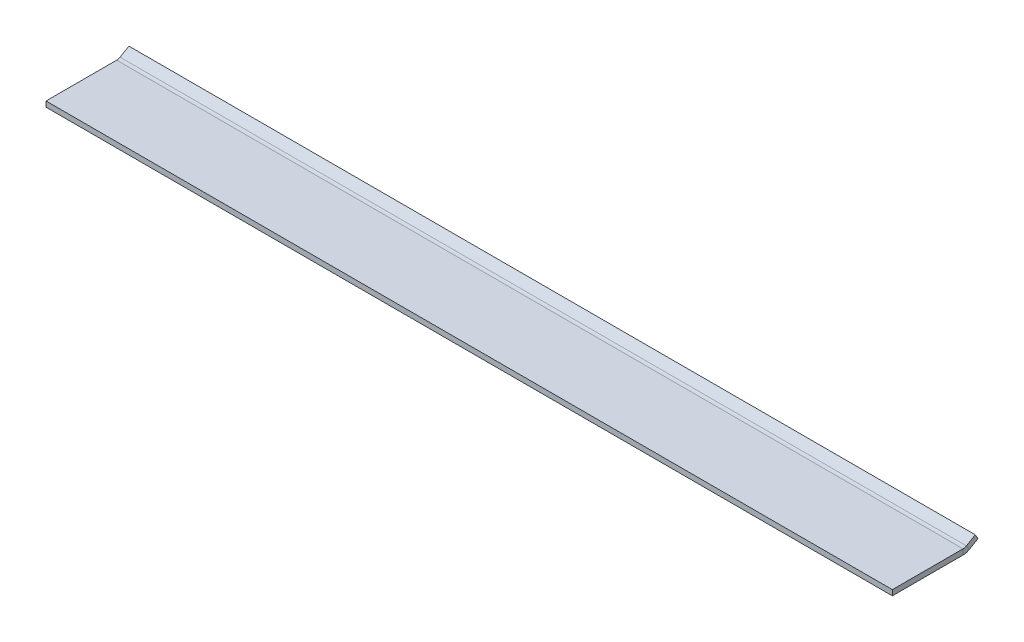
ISO-10303-21;
HEADER;
FILE_DESCRIPTION(('STEP AP214'),'2;1');
FILE_NAME('part.step','',(''),(''),'','','');
FILE_SCHEMA(('AUTOMOTIVE_DESIGN { 1 0 10303 214 1 1 1 1 }'));
ENDSEC;
DATA;
#1=APPLICATION_CONTEXT('core data for automotive mechanical design processes');
#2=APPLICATION_PROTOCOL_DEFINITION('international standard','automotive_design',2000,#1);
#3=PRODUCT_CONTEXT('',#1,'mechanical');
#4=PRODUCT('Part','Part','',(#3));
#5=PRODUCT_RELATED_PRODUCT_CATEGORY('part','',(#4));
#6=PRODUCT_DEFINITION_FORMATION('','',#4);
#7=PRODUCT_DEFINITION_CONTEXT('part definition',#1,'design');
#8=PRODUCT_DEFINITION('design','',#6,#7);
#9=PRODUCT_DEFINITION_SHAPE('','',#8);
#10=(LENGTH_UNIT() NAMED_UNIT(*) SI_UNIT(.MILLI.,.METRE.));
#11=(NAMED_UNIT(*) PLANE_ANGLE_UNIT() SI_UNIT($,.RADIAN.));
#12=(NAMED_UNIT(*) SI_UNIT($,.STERADIAN.) SOLID_ANGLE_UNIT());
#13=UNCERTAINTY_MEASURE_WITH_UNIT(LENGTH_MEASURE(1.E-05),#10,'distance_accuracy_value','');
#14=(GEOMETRIC_REPRESENTATION_CONTEXT(3) GLOBAL_UNCERTAINTY_ASSIGNED_CONTEXT((#13)) GLOBAL_UNIT_ASSIGNED_CONTEXT((#10,
#11,#12)) REPRESENTATION_CONTEXT('',''));
#15=CARTESIAN_POINT('',(0.,0.,0.));
#16=DIRECTION('',(0.,0.,1.));
#17=DIRECTION('',(1.,0.,0.));
#18=AXIS2_PLACEMENT_3D('',#15,#16,#17);
#19=CARTESIAN_POINT('',(-940.,-12.,92.5));
#20=DIRECTION('',(-1.,0.,0.));
#21=DIRECTION('',(0.,0.,1.));
#22=AXIS2_PLACEMENT_3D('',#19,#20,#21);
#23=PLANE('',#22);
#24=DIRECTION('',(0.,0.,1.));
#25=VECTOR('',#24,1.);
#26=CARTESIAN_POINT('',(-940.,0.,92.5));
#27=LINE('',#26,#25);
#28=CARTESIAN_POINT('',(-940.,1.04083408558608E-13,-64.480762113533));
#29=VERTEX_POINT('',#28);
#30=CARTESIAN_POINT('',(-940.,0.,92.5));
#31=VERTEX_POINT('',#30);
#32=EDGE_CURVE('E107',#29,#31,#27,.T.);
#33=ORIENTED_EDGE('',*,*,#32,.F.);
#34=DIRECTION('',(0.,-1.,0.));
#35=VECTOR('',#34,1.);
#36=CARTESIAN_POINT('',(-940.,1.04083408558608E-13,-64.480762113533));
#37=LINE('',#36,#35);
#38=CARTESIAN_POINT('',(-940.,-11.9999999999999,-64.480762113533));
#39=VERTEX_POINT('',#38);
#40=EDGE_CURVE('E120',#29,#39,#37,.T.);
#41=ORIENTED_EDGE('',*,*,#40,.T.);
#42=DIRECTION('',(0.,0.,1.));
#43=VECTOR('',#42,1.);
#44=CARTESIAN_POINT('',(-940.,-12.,92.5));
#45=LINE('',#44,#43);
#46=CARTESIAN_POINT('',(-940.,-12.,92.5));
#47=VERTEX_POINT('',#46);
#48=EDGE_CURVE('E114',#39,#47,#45,.T.);
#49=ORIENTED_EDGE('',*,*,#48,.T.);
#50=DIRECTION('',(0.,1.,0.));
#51=VECTOR('',#50,1.);
#52=CARTESIAN_POINT('',(-940.,-12.,92.5));
#53=LINE('',#52,#51);
#54=EDGE_CURVE('E63',#47,#31,#53,.T.);
#55=ORIENTED_EDGE('',*,*,#54,.T.);
#56=EDGE_LOOP('',(#33,#41,#49,#55));
#57=FACE_BOUND('',#56,.T.);
#58=ADVANCED_FACE('F59',(#57),#23,.T.);
#59=CARTESIAN_POINT('',(0.,-12.,0.));
#60=DIRECTION('',(0.,-1.,0.));
#61=DIRECTION('',(0.,0.,-1.));
#62=AXIS2_PLACEMENT_3D('',#59,#60,#61);
#63=PLANE('',#62);
#64=ORIENTED_EDGE('',*,*,#48,.F.);
#65=DIRECTION('',(-1.,0.,0.));
#66=VECTOR('',#65,1.);
#67=CARTESIAN_POINT('',(-940.,-11.9999999999999,-64.480762113533));
#68=LINE('',#67,#66);
#69=CARTESIAN_POINT('',(940.,-12.,-64.480762113533));
#70=VERTEX_POINT('',#69);
#71=EDGE_CURVE('E137',#39,#70,#68,.F.);
#72=ORIENTED_EDGE('',*,*,#71,.T.);
#73=DIRECTION('',(0.,0.,-1.));
#74=VECTOR('',#73,1.);
#75=CARTESIAN_POINT('',(940.,-12.,92.5));
#76=LINE('',#75,#74);
#77=CARTESIAN_POINT('',(940.,-12.,92.5));
#78=VERTEX_POINT('',#77);
#79=EDGE_CURVE('E112',#78,#70,#76,.T.);
#80=ORIENTED_EDGE('',*,*,#79,.F.);
#81=DIRECTION('',(1.,0.,0.));
#82=VECTOR('',#81,1.);
#83=CARTESIAN_POINT('',(-940.,-12.,92.5));
#84=LINE('',#83,#82);
#85=EDGE_CURVE('E99',#47,#78,#84,.T.);
#86=ORIENTED_EDGE('',*,*,#85,.F.);
#87=EDGE_LOOP('',(#64,#72,#80,#86));
#88=FACE_BOUND('',#87,.T.);
#89=ADVANCED_FACE('F227',(#88),#63,.T.);
#90=CARTESIAN_POINT('',(0.,0.,0.));
#91=DIRECTION('',(0.,-1.,0.));
#92=DIRECTION('',(0.,0.,-1.));
#93=AXIS2_PLACEMENT_3D('',#90,#91,#92);
#94=PLANE('',#93);
#95=DIRECTION('',(-1.,0.,0.));
#96=VECTOR('',#95,1.);
#97=CARTESIAN_POINT('',(-940.,1.04083408558608E-13,-64.480762113533));
#98=LINE('',#97,#96);
#99=CARTESIAN_POINT('',(940.,0.,-64.480762113533));
#100=VERTEX_POINT('',#99);
#101=EDGE_CURVE('E127',#29,#100,#98,.F.);
#102=ORIENTED_EDGE('',*,*,#101,.F.);
#103=ORIENTED_EDGE('',*,*,#32,.T.);
#104=DIRECTION('',(1.,0.,0.));
#105=VECTOR('',#104,1.);
#106=CARTESIAN_POINT('',(-940.,0.,92.5));
#107=LINE('',#106,#105);
#108=CARTESIAN_POINT('',(940.,0.,92.5));
#109=VERTEX_POINT('',#108);
#110=EDGE_CURVE('E97',#31,#109,#107,.T.);
#111=ORIENTED_EDGE('',*,*,#110,.T.);
#112=DIRECTION('',(0.,0.,-1.));
#113=VECTOR('',#112,1.);
#114=CARTESIAN_POINT('',(940.,0.,92.5));
#115=LINE('',#114,#113);
#116=EDGE_CURVE('E102',#109,#100,#115,.T.);
#117=ORIENTED_EDGE('',*,*,#116,.T.);
#118=EDGE_LOOP('',(#102,#103,#111,#117));
#119=FACE_BOUND('',#118,.T.);
#120=ADVANCED_FACE('F109',(#119),#94,.F.);
#121=CARTESIAN_POINT('',(940.,-12.,92.5));
#122=DIRECTION('',(1.,0.,0.));
#123=DIRECTION('',(0.,0.,-1.));
#124=AXIS2_PLACEMENT_3D('',#121,#122,#123);
#125=PLANE('',#124);
#126=DIRECTION('',(0.,-1.,0.));
#127=VECTOR('',#126,1.);
#128=CARTESIAN_POINT('',(940.,0.,-64.480762113533));
#129=LINE('',#128,#127);
#130=EDGE_CURVE('E104',#100,#70,#129,.T.);
#131=ORIENTED_EDGE('',*,*,#130,.F.);
#132=ORIENTED_EDGE('',*,*,#116,.F.);
#133=DIRECTION('',(0.,1.,0.));
#134=VECTOR('',#133,1.);
#135=CARTESIAN_POINT('',(940.,-12.,92.5));
#136=LINE('',#135,#134);
#137=EDGE_CURVE('E13',#78,#109,#136,.T.);
#138=ORIENTED_EDGE('',*,*,#137,.F.);
#139=ORIENTED_EDGE('',*,*,#79,.T.);
#140=EDGE_LOOP('',(#131,#132,#138,#139));
#141=FACE_BOUND('',#140,.T.);
#142=ADVANCED_FACE('F61',(#141),#125,.T.);
#143=CARTESIAN_POINT('',(-940.,-12.,92.5));
#144=DIRECTION('',(0.,0.,1.));
#145=DIRECTION('',(1.,0.,0.));
#146=AXIS2_PLACEMENT_3D('',#143,#144,#145);
#147=PLANE('',#146);
#148=ORIENTED_EDGE('',*,*,#110,.F.);
#149=ORIENTED_EDGE('',*,*,#54,.F.);
#150=ORIENTED_EDGE('',*,*,#85,.T.);
#151=ORIENTED_EDGE('',*,*,#137,.T.);
#152=EDGE_LOOP('',(#148,#149,#150,#151));
#153=FACE_BOUND('',#152,.T.);
#154=ADVANCED_FACE('F94',(#153),#147,.T.);
#155=CARTESIAN_POINT('',(940.,14.9999999999999,-64.480762113533));
#156=DIRECTION('',(1.,0.,0.));
#157=DIRECTION('',(0.,1.,0.));
#158=AXIS2_PLACEMENT_3D('',#155,#156,#157);
#159=PLANE('',#158);
#160=DIRECTION('',(0.,0.866025403784441,0.499999999999995));
#161=VECTOR('',#160,1.);
#162=CARTESIAN_POINT('',(940.,-8.38268590217991,-77.9807621135329));
#163=LINE('',#162,#161);
#164=CARTESIAN_POINT('',(940.,2.00961894323337,-71.9807621135329));
#165=VERTEX_POINT('',#164);
#166=CARTESIAN_POINT('',(940.,-8.38268590217993,-77.9807621135328));
#167=VERTEX_POINT('',#166);
#168=EDGE_CURVE('E141',#165,#167,#163,.F.);
#169=ORIENTED_EDGE('',*,*,#168,.F.);
#170=CARTESIAN_POINT('',(940.,14.9999999999999,-64.480762113533));
#171=DIRECTION('',(-1.,0.,0.));
#172=DIRECTION('',(0.,-1.,0.));
#173=AXIS2_PLACEMENT_3D('',#170,#171,#172);
#174=CIRCLE('',#173,14.9999999999999);
#175=EDGE_CURVE('E131',#100,#165,#174,.F.);
#176=ORIENTED_EDGE('',*,*,#175,.F.);
#177=ORIENTED_EDGE('',*,*,#130,.T.);
#178=CARTESIAN_POINT('',(940.,14.9999999999999,-64.480762113533));
#179=DIRECTION('',(-1.,0.,0.));
#180=DIRECTION('',(0.,-1.,0.));
#181=AXIS2_PLACEMENT_3D('',#178,#179,#180);
#182=CIRCLE('',#181,26.9999999999999);
#183=EDGE_CURVE('E74',#70,#167,#182,.F.);
#184=ORIENTED_EDGE('',*,*,#183,.T.);
#185=EDGE_LOOP('',(#169,#176,#177,#184));
#186=FACE_BOUND('',#185,.T.);
#187=ADVANCED_FACE('F229',(#186),#159,.T.);
#188=CARTESIAN_POINT('',(-940.,15.0000000000001,-64.480762113533));
#189=DIRECTION('',(1.,0.,0.));
#190=DIRECTION('',(0.,1.,0.));
#191=AXIS2_PLACEMENT_3D('',#188,#189,#190);
#192=PLANE('',#191);
#193=CARTESIAN_POINT('',(-940.,15.0000000000001,-64.480762113533));
#194=DIRECTION('',(-1.,0.,0.));
#195=DIRECTION('',(0.,-1.,0.));
#196=AXIS2_PLACEMENT_3D('',#193,#194,#195);
#197=CIRCLE('',#196,14.9999999999999);
#198=CARTESIAN_POINT('',(-940.,2.00961894323347,-71.9807621135329));
#199=VERTEX_POINT('',#198);
#200=EDGE_CURVE('E124',#199,#29,#197,.T.);
#201=ORIENTED_EDGE('',*,*,#200,.F.);
#202=DIRECTION('',(0.,0.866025403784441,0.499999999999995));
#203=VECTOR('',#202,1.);
#204=CARTESIAN_POINT('',(-940.,2.00961894323338,-71.9807621135329));
#205=LINE('',#204,#203);
#206=CARTESIAN_POINT('',(-940.,-8.38268590217992,-77.9807621135329));
#207=VERTEX_POINT('',#206);
#208=EDGE_CURVE('E147',#199,#207,#205,.F.);
#209=ORIENTED_EDGE('',*,*,#208,.T.);
#210=CARTESIAN_POINT('',(-940.,15.0000000000001,-64.480762113533));
#211=DIRECTION('',(-1.,0.,0.));
#212=DIRECTION('',(0.,-1.,0.));
#213=AXIS2_PLACEMENT_3D('',#210,#211,#212);
#214=CIRCLE('',#213,26.9999999999999);
#215=EDGE_CURVE('E134',#207,#39,#214,.T.);
#216=ORIENTED_EDGE('',*,*,#215,.T.);
#217=ORIENTED_EDGE('',*,*,#40,.F.);
#218=EDGE_LOOP('',(#201,#209,#216,#217));
#219=FACE_BOUND('',#218,.T.);
#220=ADVANCED_FACE('F221',(#219),#192,.F.);
#221=CARTESIAN_POINT('',(-940.,15.0000000000001,-64.480762113533));
#222=DIRECTION('',(-1.,0.,0.));
#223=DIRECTION('',(0.,-0.866025403784442,-0.499999999999995));
#224=AXIS2_PLACEMENT_3D('',#221,#222,#223);
#225=CYLINDRICAL_SURFACE('',#224,26.9999999999999);
#226=ORIENTED_EDGE('',*,*,#71,.F.);
#227=ORIENTED_EDGE('',*,*,#215,.F.);
#228=DIRECTION('',(-1.,0.,0.));
#229=VECTOR('',#228,1.);
#230=CARTESIAN_POINT('',(940.,-8.38268590217992,-77.9807621135329));
#231=LINE('',#230,#229);
#232=EDGE_CURVE('E150',#207,#167,#231,.F.);
#233=ORIENTED_EDGE('',*,*,#232,.T.);
#234=ORIENTED_EDGE('',*,*,#183,.F.);
#235=EDGE_LOOP('',(#226,#227,#233,#234));
#236=FACE_BOUND('',#235,.T.);
#237=ADVANCED_FACE('F228',(#236),#225,.T.);
#238=CARTESIAN_POINT('',(-940.,15.0000000000001,-64.480762113533));
#239=DIRECTION('',(-1.,0.,0.));
#240=DIRECTION('',(0.,-0.866025403784442,-0.499999999999995));
#241=AXIS2_PLACEMENT_3D('',#238,#239,#240);
#242=CYLINDRICAL_SURFACE('',#241,14.9999999999999);
#243=ORIENTED_EDGE('',*,*,#101,.T.);
#244=ORIENTED_EDGE('',*,*,#175,.T.);
#245=DIRECTION('',(-1.,0.,0.));
#246=VECTOR('',#245,1.);
#247=CARTESIAN_POINT('',(940.,2.00961894323338,-71.9807621135329));
#248=LINE('',#247,#246);
#249=EDGE_CURVE('E144',#165,#199,#248,.T.);
#250=ORIENTED_EDGE('',*,*,#249,.T.);
#251=ORIENTED_EDGE('',*,*,#200,.T.);
#252=EDGE_LOOP('',(#243,#244,#250,#251));
#253=FACE_BOUND('',#252,.T.);
#254=ADVANCED_FACE('F223',(#253),#242,.F.);
#255=CARTESIAN_POINT('',(940.,-10.3923048454133,-74.4999999999997));
#256=DIRECTION('',(-1.,0.,0.));
#257=DIRECTION('',(0.,0.,1.));
#258=AXIS2_PLACEMENT_3D('',#255,#256,#257);
#259=PLANE('',#258);
#260=ORIENTED_EDGE('',*,*,#168,.T.);
#261=DIRECTION('',(0.,-0.499999999999995,0.866025403784442));
#262=VECTOR('',#261,1.);
#263=CARTESIAN_POINT('',(940.,-50.4459797704433,-5.12499999999925));
#264=LINE('',#263,#262);
#265=CARTESIAN_POINT('',(940.,2.99999999999986,-97.6961524227065));
#266=VERTEX_POINT('',#265);
#267=EDGE_CURVE('E161',#266,#167,#264,.T.);
#268=ORIENTED_EDGE('',*,*,#267,.F.);
#269=DIRECTION('',(0.,0.866025403784442,0.499999999999995));
#270=VECTOR('',#269,1.);
#271=CARTESIAN_POINT('',(940.,2.99999999999985,-97.6961524227065));
#272=LINE('',#271,#270);
#273=CARTESIAN_POINT('',(940.,13.3923048454131,-91.6961524227065));
#274=VERTEX_POINT('',#273);
#275=EDGE_CURVE('E170',#266,#274,#272,.T.);
#276=ORIENTED_EDGE('',*,*,#275,.T.);
#277=DIRECTION('',(0.,0.499999999999995,-0.866025403784442));
#278=VECTOR('',#277,1.);
#279=CARTESIAN_POINT('',(940.,0.,-68.4999999999998));
#280=LINE('',#279,#278);
#281=EDGE_CURVE('E152',#274,#165,#280,.F.);
#282=ORIENTED_EDGE('',*,*,#281,.T.);
#283=EDGE_LOOP('',(#260,#268,#276,#282));
#284=FACE_BOUND('',#283,.T.);
#285=ADVANCED_FACE('F196',(#284),#259,.F.);
#286=CARTESIAN_POINT('',(-940.,2.99999999999986,-97.6961524227065));
#287=DIRECTION('',(1.,0.,0.));
#288=DIRECTION('',(0.,0.,-1.));
#289=AXIS2_PLACEMENT_3D('',#286,#287,#288);
#290=PLANE('',#289);
#291=ORIENTED_EDGE('',*,*,#208,.F.);
#292=DIRECTION('',(0.,-0.499999999999995,0.866025403784442));
#293=VECTOR('',#292,1.);
#294=CARTESIAN_POINT('',(-940.,13.3923048454131,-91.6961524227065));
#295=LINE('',#294,#293);
#296=CARTESIAN_POINT('',(-940.,13.3923048454131,-91.6961524227065));
#297=VERTEX_POINT('',#296);
#298=EDGE_CURVE('E155',#199,#297,#295,.F.);
#299=ORIENTED_EDGE('',*,*,#298,.T.);
#300=DIRECTION('',(0.,0.866025403784442,0.499999999999995));
#301=VECTOR('',#300,1.);
#302=CARTESIAN_POINT('',(-940.,2.99999999999986,-97.6961524227065));
#303=LINE('',#302,#301);
#304=CARTESIAN_POINT('',(-940.,2.99999999999985,-97.6961524227065));
#305=VERTEX_POINT('',#304);
#306=EDGE_CURVE('E128',#305,#297,#303,.T.);
#307=ORIENTED_EDGE('',*,*,#306,.F.);
#308=DIRECTION('',(0.,0.499999999999995,-0.866025403784442));
#309=VECTOR('',#308,1.);
#310=CARTESIAN_POINT('',(-940.,-50.4459797704433,-5.12499999999925));
#311=LINE('',#310,#309);
#312=EDGE_CURVE('E164',#207,#305,#311,.T.);
#313=ORIENTED_EDGE('',*,*,#312,.F.);
#314=EDGE_LOOP('',(#291,#299,#307,#313));
#315=FACE_BOUND('',#314,.T.);
#316=ADVANCED_FACE('F218',(#315),#290,.F.);
#317=CARTESIAN_POINT('',(0.,-50.4459797704433,-5.12499999999925));
#318=DIRECTION('',(0.,0.866025403784442,0.499999999999995));
#319=DIRECTION('',(0.,-0.499999999999995,0.866025403784442));
#320=AXIS2_PLACEMENT_3D('',#317,#318,#319);
#321=PLANE('',#320);
#322=ORIENTED_EDGE('',*,*,#232,.F.);
#323=ORIENTED_EDGE('',*,*,#312,.T.);
#324=DIRECTION('',(1.,0.,0.));
#325=VECTOR('',#324,1.);
#326=CARTESIAN_POINT('',(0.,2.99999999999986,-97.6961524227065));
#327=LINE('',#326,#325);
#328=EDGE_CURVE('E167',#305,#266,#327,.T.);
#329=ORIENTED_EDGE('',*,*,#328,.T.);
#330=ORIENTED_EDGE('',*,*,#267,.T.);
#331=EDGE_LOOP('',(#322,#323,#329,#330));
#332=FACE_BOUND('',#331,.T.);
#333=ADVANCED_FACE('F216',(#332),#321,.F.);
#334=CARTESIAN_POINT('',(0.,-40.05367492503,0.875000000000695));
#335=DIRECTION('',(0.,0.866025403784442,0.499999999999995));
#336=DIRECTION('',(0.,-0.499999999999995,0.866025403784442));
#337=AXIS2_PLACEMENT_3D('',#334,#335,#336);
#338=PLANE('',#337);
#339=ORIENTED_EDGE('',*,*,#298,.F.);
#340=ORIENTED_EDGE('',*,*,#249,.F.);
#341=ORIENTED_EDGE('',*,*,#281,.F.);
#342=DIRECTION('',(-1.,0.,0.));
#343=VECTOR('',#342,1.);
#344=CARTESIAN_POINT('',(940.,13.3923048454131,-91.6961524227065));
#345=LINE('',#344,#343);
#346=EDGE_CURVE('E158',#297,#274,#345,.F.);
#347=ORIENTED_EDGE('',*,*,#346,.F.);
#348=EDGE_LOOP('',(#339,#340,#341,#347));
#349=FACE_BOUND('',#348,.T.);
#350=ADVANCED_FACE('F190',(#349),#338,.T.);
#351=CARTESIAN_POINT('',(940.,2.99999999999986,-97.6961524227065));
#352=DIRECTION('',(0.,-0.499999999999995,0.866025403784442));
#353=DIRECTION('',(0.,-0.866025403784442,-0.499999999999995));
#354=AXIS2_PLACEMENT_3D('',#351,#352,#353);
#355=PLANE('',#354);
#356=ORIENTED_EDGE('',*,*,#346,.T.);
#357=ORIENTED_EDGE('',*,*,#275,.F.);
#358=ORIENTED_EDGE('',*,*,#328,.F.);
#359=ORIENTED_EDGE('',*,*,#306,.T.);
#360=EDGE_LOOP('',(#356,#357,#358,#359));
#361=FACE_BOUND('',#360,.T.);
#362=ADVANCED_FACE('F179',(#361),#355,.F.);
#363=CLOSED_SHELL('',(#58,#89,#120,#142,#154,#187,#220,#237,#254,#285,#316,#333,#350,#362));
#364=MANIFOLD_SOLID_BREP('B2',#363);
#365=ADVANCED_BREP_SHAPE_REPRESENTATION('',(#18,#364),#14);
#366=SHAPE_DEFINITION_REPRESENTATION(#9,#365);
ENDSEC;
END-ISO-10303-21;
